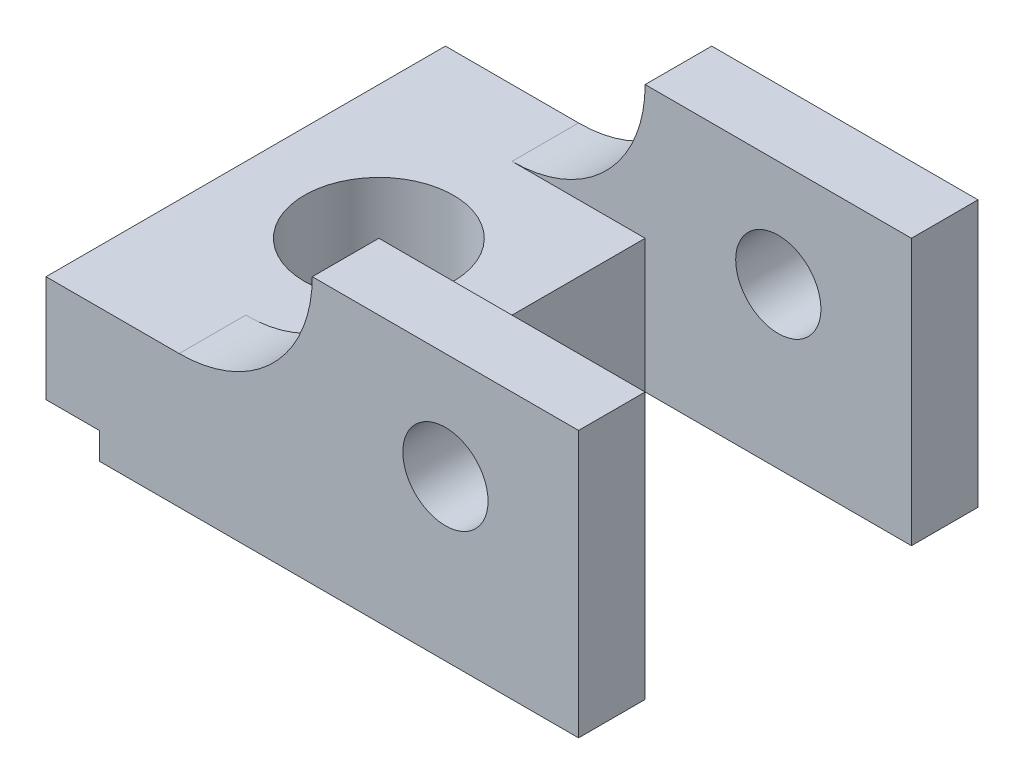
ISO-10303-21;
HEADER;
FILE_DESCRIPTION(('STEP AP214'),'2;1');
FILE_NAME('part.step','',(''),(''),'','','');
FILE_SCHEMA(('AUTOMOTIVE_DESIGN { 1 0 10303 214 1 1 1 1 }'));
ENDSEC;
DATA;
#1=APPLICATION_CONTEXT('core data for automotive mechanical design processes');
#2=APPLICATION_PROTOCOL_DEFINITION('international standard','automotive_design',2000,#1);
#3=PRODUCT_CONTEXT('',#1,'mechanical');
#4=PRODUCT('Part','Part','',(#3));
#5=PRODUCT_RELATED_PRODUCT_CATEGORY('part','',(#4));
#6=PRODUCT_DEFINITION_FORMATION('','',#4);
#7=PRODUCT_DEFINITION_CONTEXT('part definition',#1,'design');
#8=PRODUCT_DEFINITION('design','',#6,#7);
#9=PRODUCT_DEFINITION_SHAPE('','',#8);
#10=(LENGTH_UNIT() NAMED_UNIT(*) SI_UNIT(.MILLI.,.METRE.));
#11=(NAMED_UNIT(*) PLANE_ANGLE_UNIT() SI_UNIT($,.RADIAN.));
#12=(NAMED_UNIT(*) SI_UNIT($,.STERADIAN.) SOLID_ANGLE_UNIT());
#13=UNCERTAINTY_MEASURE_WITH_UNIT(LENGTH_MEASURE(1.E-05),#10,'distance_accuracy_value','');
#14=(GEOMETRIC_REPRESENTATION_CONTEXT(3) GLOBAL_UNCERTAINTY_ASSIGNED_CONTEXT((#13)) GLOBAL_UNIT_ASSIGNED_CONTEXT((#10,
#11,#12)) REPRESENTATION_CONTEXT('',''));
#15=CARTESIAN_POINT('',(0.,0.,0.));
#16=DIRECTION('',(0.,0.,1.));
#17=DIRECTION('',(1.,0.,0.));
#18=AXIS2_PLACEMENT_3D('',#15,#16,#17);
#19=CARTESIAN_POINT('',(0.,0.,15.));
#20=DIRECTION('',(0.,1.,0.));
#21=DIRECTION('',(0.,0.,1.));
#22=AXIS2_PLACEMENT_3D('',#19,#20,#21);
#23=PLANE('',#22);
#24=DIRECTION('',(0.,0.,-1.));
#25=VECTOR('',#24,1.);
#26=CARTESIAN_POINT('',(2.,0.,0.));
#27=LINE('',#26,#25);
#28=CARTESIAN_POINT('',(2.,0.,15.));
#29=VERTEX_POINT('',#28);
#30=CARTESIAN_POINT('',(2.,0.,0.));
#31=VERTEX_POINT('',#30);
#32=EDGE_CURVE('E51',#29,#31,#27,.T.);
#33=ORIENTED_EDGE('',*,*,#32,.F.);
#34=DIRECTION('',(1.,0.,0.));
#35=VECTOR('',#34,1.);
#36=CARTESIAN_POINT('',(0.,0.,15.));
#37=LINE('',#36,#35);
#38=CARTESIAN_POINT('',(0.,0.,15.));
#39=VERTEX_POINT('',#38);
#40=EDGE_CURVE('E149',#39,#29,#37,.T.);
#41=ORIENTED_EDGE('',*,*,#40,.F.);
#42=DIRECTION('',(0.,0.,-1.));
#43=VECTOR('',#42,1.);
#44=CARTESIAN_POINT('',(0.,0.,15.));
#45=LINE('',#44,#43);
#46=CARTESIAN_POINT('',(0.,0.,0.));
#47=VERTEX_POINT('',#46);
#48=EDGE_CURVE('E241',#39,#47,#45,.T.);
#49=ORIENTED_EDGE('',*,*,#48,.T.);
#50=DIRECTION('',(1.,0.,0.));
#51=VECTOR('',#50,1.);
#52=CARTESIAN_POINT('',(0.,0.,0.));
#53=LINE('',#52,#51);
#54=EDGE_CURVE('E56',#47,#31,#53,.T.);
#55=ORIENTED_EDGE('',*,*,#54,.T.);
#56=EDGE_LOOP('',(#33,#41,#49,#55));
#57=FACE_BOUND('',#56,.T.);
#58=ADVANCED_FACE('F35',(#57),#23,.F.);
#59=CARTESIAN_POINT('',(5.,-7.2,7.5));
#60=DIRECTION('',(0.,1.,0.));
#61=DIRECTION('',(0.,0.,1.));
#62=AXIS2_PLACEMENT_3D('',#59,#60,#61);
#63=CYLINDRICAL_SURFACE('',#62,1.97447116828648);
#64=CARTESIAN_POINT('',(5.,1.,7.5));
#65=DIRECTION('',(0.,1.,0.));
#66=DIRECTION('',(0.,0.,1.));
#67=AXIS2_PLACEMENT_3D('',#64,#65,#66);
#68=CIRCLE('',#67,1.97447116828648);
#69=CARTESIAN_POINT('',(5.,1.,9.47447116828648));
#70=VERTEX_POINT('',#69);
#71=EDGE_CURVE('E39',#70,#70,#68,.F.);
#72=ORIENTED_EDGE('',*,*,#71,.F.);
#73=EDGE_LOOP('',(#72));
#74=FACE_BOUND('',#73,.T.);
#75=CARTESIAN_POINT('',(5.,-1.,7.5));
#76=DIRECTION('',(0.,-1.,0.));
#77=DIRECTION('',(0.,0.,-1.));
#78=AXIS2_PLACEMENT_3D('',#75,#76,#77);
#79=CIRCLE('',#78,1.97447116828648);
#80=CARTESIAN_POINT('',(5.,-1.,5.52552883171352));
#81=VERTEX_POINT('',#80);
#82=EDGE_CURVE('E169',#81,#81,#79,.T.);
#83=ORIENTED_EDGE('',*,*,#82,.T.);
#84=EDGE_LOOP('',(#83));
#85=FACE_BOUND('',#84,.T.);
#86=ADVANCED_FACE('F286',(#74,#85),#63,.F.);
#87=CARTESIAN_POINT('',(20.,4.,15.));
#88=DIRECTION('',(-1.,0.,0.));
#89=DIRECTION('',(0.,0.,1.));
#90=AXIS2_PLACEMENT_3D('',#87,#88,#89);
#91=PLANE('',#90);
#92=DIRECTION('',(0.,0.,-1.));
#93=VECTOR('',#92,1.);
#94=CARTESIAN_POINT('',(20.,-1.,15.));
#95=LINE('',#94,#93);
#96=CARTESIAN_POINT('',(20.,-1.,15.));
#97=VERTEX_POINT('',#96);
#98=CARTESIAN_POINT('',(20.,-0.999999999999999,12.5));
#99=VERTEX_POINT('',#98);
#100=EDGE_CURVE('E145',#97,#99,#95,.T.);
#101=ORIENTED_EDGE('',*,*,#100,.T.);
#102=DIRECTION('',(0.,1.,0.));
#103=VECTOR('',#102,1.);
#104=CARTESIAN_POINT('',(20.,-11.,12.5));
#105=LINE('',#104,#103);
#106=CARTESIAN_POINT('',(20.,9.,12.5));
#107=VERTEX_POINT('',#106);
#108=EDGE_CURVE('E181',#99,#107,#105,.T.);
#109=ORIENTED_EDGE('',*,*,#108,.T.);
#110=DIRECTION('',(0.,0.,-1.));
#111=VECTOR('',#110,1.);
#112=CARTESIAN_POINT('',(20.,9.,15.));
#113=LINE('',#112,#111);
#114=CARTESIAN_POINT('',(20.,9.,15.));
#115=VERTEX_POINT('',#114);
#116=EDGE_CURVE('E236',#115,#107,#113,.T.);
#117=ORIENTED_EDGE('',*,*,#116,.F.);
#118=DIRECTION('',(0.,1.,0.));
#119=VECTOR('',#118,1.);
#120=CARTESIAN_POINT('',(20.,0.,15.));
#121=LINE('',#120,#119);
#122=EDGE_CURVE('E148',#97,#115,#121,.T.);
#123=ORIENTED_EDGE('',*,*,#122,.F.);
#124=EDGE_LOOP('',(#101,#109,#117,#123));
#125=FACE_BOUND('',#124,.T.);
#126=ADVANCED_FACE('F293',(#125),#91,.F.);
#127=CARTESIAN_POINT('',(20.,9.,15.));
#128=DIRECTION('',(0.,-1.,0.));
#129=DIRECTION('',(1.,0.,0.));
#130=AXIS2_PLACEMENT_3D('',#127,#128,#129);
#131=PLANE('',#130);
#132=ORIENTED_EDGE('',*,*,#116,.T.);
#133=DIRECTION('',(1.,0.,0.));
#134=VECTOR('',#133,1.);
#135=CARTESIAN_POINT('',(20.,9.,12.5));
#136=LINE('',#135,#134);
#137=CARTESIAN_POINT('',(10.,9.,12.5));
#138=VERTEX_POINT('',#137);
#139=EDGE_CURVE('E178',#138,#107,#136,.T.);
#140=ORIENTED_EDGE('',*,*,#139,.F.);
#141=DIRECTION('',(0.,0.,-1.));
#142=VECTOR('',#141,1.);
#143=CARTESIAN_POINT('',(10.,9.,15.));
#144=LINE('',#143,#142);
#145=CARTESIAN_POINT('',(10.,9.,15.));
#146=VERTEX_POINT('',#145);
#147=EDGE_CURVE('E232',#146,#138,#144,.T.);
#148=ORIENTED_EDGE('',*,*,#147,.F.);
#149=DIRECTION('',(-1.,0.,0.));
#150=VECTOR('',#149,1.);
#151=CARTESIAN_POINT('',(20.,9.,15.));
#152=LINE('',#151,#150);
#153=EDGE_CURVE('E209',#115,#146,#152,.T.);
#154=ORIENTED_EDGE('',*,*,#153,.F.);
#155=EDGE_LOOP('',(#132,#140,#148,#154));
#156=FACE_BOUND('',#155,.T.);
#157=ADVANCED_FACE('F271',(#156),#131,.F.);
#158=CARTESIAN_POINT('',(15.,5.,15.));
#159=DIRECTION('',(0.,0.,-1.));
#160=DIRECTION('',(-1.,0.,0.));
#161=AXIS2_PLACEMENT_3D('',#158,#159,#160);
#162=CYLINDRICAL_SURFACE('',#161,1.6);
#163=CARTESIAN_POINT('',(15.,5.,12.5));
#164=DIRECTION('',(0.,0.,1.));
#165=DIRECTION('',(1.,0.,0.));
#166=AXIS2_PLACEMENT_3D('',#163,#164,#165);
#167=CIRCLE('',#166,1.6);
#168=CARTESIAN_POINT('',(16.6,5.,12.5));
#169=VERTEX_POINT('',#168);
#170=EDGE_CURVE('E194',#169,#169,#167,.T.);
#171=ORIENTED_EDGE('',*,*,#170,.F.);
#172=EDGE_LOOP('',(#171));
#173=FACE_BOUND('',#172,.T.);
#174=CARTESIAN_POINT('',(15.,5.,15.));
#175=DIRECTION('',(0.,0.,1.));
#176=DIRECTION('',(1.,0.,0.));
#177=AXIS2_PLACEMENT_3D('',#174,#175,#176);
#178=CIRCLE('',#177,1.6);
#179=CARTESIAN_POINT('',(16.6,5.,15.));
#180=VERTEX_POINT('',#179);
#181=EDGE_CURVE('E198',#180,#180,#178,.T.);
#182=ORIENTED_EDGE('',*,*,#181,.T.);
#183=EDGE_LOOP('',(#182));
#184=FACE_BOUND('',#183,.T.);
#185=ADVANCED_FACE('F342',(#173,#184),#162,.F.);
#186=CARTESIAN_POINT('',(0.,0.,15.));
#187=DIRECTION('',(0.,0.,-1.));
#188=DIRECTION('',(-1.,0.,0.));
#189=AXIS2_PLACEMENT_3D('',#186,#187,#188);
#190=PLANE('',#189);
#191=DIRECTION('',(0.,1.,0.));
#192=VECTOR('',#191,1.);
#193=CARTESIAN_POINT('',(2.,-1.,15.));
#194=LINE('',#193,#192);
#195=CARTESIAN_POINT('',(2.,-1.,15.));
#196=VERTEX_POINT('',#195);
#197=EDGE_CURVE('E152',#196,#29,#194,.T.);
#198=ORIENTED_EDGE('',*,*,#197,.F.);
#199=DIRECTION('',(1.,0.,0.));
#200=VECTOR('',#199,1.);
#201=CARTESIAN_POINT('',(10.,-1.,15.));
#202=LINE('',#201,#200);
#203=EDGE_CURVE('E134',#196,#97,#202,.T.);
#204=ORIENTED_EDGE('',*,*,#203,.T.);
#205=ORIENTED_EDGE('',*,*,#122,.T.);
#206=ORIENTED_EDGE('',*,*,#153,.T.);
#207=CARTESIAN_POINT('',(5.,9.,15.));
#208=DIRECTION('',(0.,0.,-1.));
#209=DIRECTION('',(-1.,0.,0.));
#210=AXIS2_PLACEMENT_3D('',#207,#208,#209);
#211=CIRCLE('',#210,5.);
#212=CARTESIAN_POINT('',(5.,4.,15.));
#213=VERTEX_POINT('',#212);
#214=EDGE_CURVE('E11',#146,#213,#211,.T.);
#215=ORIENTED_EDGE('',*,*,#214,.T.);
#216=DIRECTION('',(-1.,0.,0.));
#217=VECTOR('',#216,1.);
#218=CARTESIAN_POINT('',(0.,4.,15.));
#219=LINE('',#218,#217);
#220=CARTESIAN_POINT('',(0.,4.,15.));
#221=VERTEX_POINT('',#220);
#222=EDGE_CURVE('E211',#213,#221,#219,.T.);
#223=ORIENTED_EDGE('',*,*,#222,.T.);
#224=DIRECTION('',(0.,-1.,0.));
#225=VECTOR('',#224,1.);
#226=CARTESIAN_POINT('',(0.,0.,15.));
#227=LINE('',#226,#225);
#228=EDGE_CURVE('E204',#221,#39,#227,.T.);
#229=ORIENTED_EDGE('',*,*,#228,.T.);
#230=ORIENTED_EDGE('',*,*,#40,.T.);
#231=EDGE_LOOP('',(#198,#204,#205,#206,#215,#223,#229,#230));
#232=FACE_BOUND('',#231,.T.);
#233=ORIENTED_EDGE('',*,*,#181,.F.);
#234=EDGE_LOOP('',(#233));
#235=FACE_BOUND('',#234,.T.);
#236=ADVANCED_FACE('F153',(#232,#235),#190,.F.);
#237=CARTESIAN_POINT('',(0.,0.,0.));
#238=DIRECTION('',(0.,0.,-1.));
#239=DIRECTION('',(-1.,0.,0.));
#240=AXIS2_PLACEMENT_3D('',#237,#238,#239);
#241=PLANE('',#240);
#242=DIRECTION('',(0.,-1.,0.));
#243=VECTOR('',#242,1.);
#244=CARTESIAN_POINT('',(0.,0.,0.));
#245=LINE('',#244,#243);
#246=CARTESIAN_POINT('',(0.,4.,0.));
#247=VERTEX_POINT('',#246);
#248=EDGE_CURVE('E201',#247,#47,#245,.T.);
#249=ORIENTED_EDGE('',*,*,#248,.F.);
#250=DIRECTION('',(-1.,0.,0.));
#251=VECTOR('',#250,1.);
#252=CARTESIAN_POINT('',(0.,4.,0.));
#253=LINE('',#252,#251);
#254=CARTESIAN_POINT('',(5.,4.,0.));
#255=VERTEX_POINT('',#254);
#256=EDGE_CURVE('E206',#255,#247,#253,.T.);
#257=ORIENTED_EDGE('',*,*,#256,.F.);
#258=CARTESIAN_POINT('',(5.,9.,0.));
#259=DIRECTION('',(0.,0.,-1.));
#260=DIRECTION('',(-1.,0.,0.));
#261=AXIS2_PLACEMENT_3D('',#258,#259,#260);
#262=CIRCLE('',#261,5.);
#263=CARTESIAN_POINT('',(10.,9.,0.));
#264=VERTEX_POINT('',#263);
#265=EDGE_CURVE('E258',#255,#264,#262,.F.);
#266=ORIENTED_EDGE('',*,*,#265,.T.);
#267=DIRECTION('',(-1.,0.,0.));
#268=VECTOR('',#267,1.);
#269=CARTESIAN_POINT('',(20.,9.,0.));
#270=LINE('',#269,#268);
#271=CARTESIAN_POINT('',(20.,9.,0.));
#272=VERTEX_POINT('',#271);
#273=EDGE_CURVE('E222',#272,#264,#270,.T.);
#274=ORIENTED_EDGE('',*,*,#273,.F.);
#275=DIRECTION('',(0.,1.,0.));
#276=VECTOR('',#275,1.);
#277=CARTESIAN_POINT('',(20.,4.,0.));
#278=LINE('',#277,#276);
#279=CARTESIAN_POINT('',(20.,-1.,0.));
#280=VERTEX_POINT('',#279);
#281=EDGE_CURVE('E219',#280,#272,#278,.T.);
#282=ORIENTED_EDGE('',*,*,#281,.F.);
#283=DIRECTION('',(1.,0.,0.));
#284=VECTOR('',#283,1.);
#285=CARTESIAN_POINT('',(10.,-1.,0.));
#286=LINE('',#285,#284);
#287=CARTESIAN_POINT('',(2.,-1.,0.));
#288=VERTEX_POINT('',#287);
#289=EDGE_CURVE('E217',#288,#280,#286,.T.);
#290=ORIENTED_EDGE('',*,*,#289,.F.);
#291=DIRECTION('',(0.,1.,0.));
#292=VECTOR('',#291,1.);
#293=CARTESIAN_POINT('',(2.,-1.,0.));
#294=LINE('',#293,#292);
#295=EDGE_CURVE('E158',#288,#31,#294,.T.);
#296=ORIENTED_EDGE('',*,*,#295,.T.);
#297=ORIENTED_EDGE('',*,*,#54,.F.);
#298=EDGE_LOOP('',(#249,#257,#266,#274,#282,#290,#296,#297));
#299=FACE_BOUND('',#298,.T.);
#300=CARTESIAN_POINT('',(15.,5.,0.));
#301=DIRECTION('',(0.,0.,1.));
#302=DIRECTION('',(1.,0.,0.));
#303=AXIS2_PLACEMENT_3D('',#300,#301,#302);
#304=CIRCLE('',#303,1.6);
#305=CARTESIAN_POINT('',(16.6,5.,0.));
#306=VERTEX_POINT('',#305);
#307=EDGE_CURVE('E197',#306,#306,#304,.T.);
#308=ORIENTED_EDGE('',*,*,#307,.T.);
#309=EDGE_LOOP('',(#308));
#310=FACE_BOUND('',#309,.T.);
#311=ADVANCED_FACE('F300',(#299,#310),#241,.T.);
#312=CARTESIAN_POINT('',(0.,0.,15.));
#313=DIRECTION('',(1.,0.,0.));
#314=DIRECTION('',(0.,0.,-1.));
#315=AXIS2_PLACEMENT_3D('',#312,#313,#314);
#316=PLANE('',#315);
#317=ORIENTED_EDGE('',*,*,#248,.T.);
#318=ORIENTED_EDGE('',*,*,#48,.F.);
#319=ORIENTED_EDGE('',*,*,#228,.F.);
#320=DIRECTION('',(0.,0.,-1.));
#321=VECTOR('',#320,1.);
#322=CARTESIAN_POINT('',(0.,4.,15.));
#323=LINE('',#322,#321);
#324=EDGE_CURVE('E213',#221,#247,#323,.T.);
#325=ORIENTED_EDGE('',*,*,#324,.T.);
#326=EDGE_LOOP('',(#317,#318,#319,#325));
#327=FACE_BOUND('',#326,.T.);
#328=ADVANCED_FACE('F284',(#327),#316,.F.);
#329=CARTESIAN_POINT('',(10.,-1.,15.));
#330=DIRECTION('',(0.,1.,0.));
#331=DIRECTION('',(0.,0.,1.));
#332=AXIS2_PLACEMENT_3D('',#329,#330,#331);
#333=PLANE('',#332);
#334=CARTESIAN_POINT('',(20.,-0.999999999999999,2.5));
#335=VERTEX_POINT('',#334);
#336=EDGE_CURVE('E239',#335,#280,#95,.T.);
#337=ORIENTED_EDGE('',*,*,#336,.F.);
#338=DIRECTION('',(-1.,0.,0.));
#339=VECTOR('',#338,1.);
#340=CARTESIAN_POINT('',(10.,-1.,2.5));
#341=LINE('',#340,#339);
#342=CARTESIAN_POINT('',(10.,-1.,2.5));
#343=VERTEX_POINT('',#342);
#344=EDGE_CURVE('E191',#335,#343,#341,.T.);
#345=ORIENTED_EDGE('',*,*,#344,.T.);
#346=DIRECTION('',(0.,0.,1.));
#347=VECTOR('',#346,1.);
#348=CARTESIAN_POINT('',(10.,-1.,0.));
#349=LINE('',#348,#347);
#350=CARTESIAN_POINT('',(10.,-1.,12.5));
#351=VERTEX_POINT('',#350);
#352=EDGE_CURVE('E162',#343,#351,#349,.T.);
#353=ORIENTED_EDGE('',*,*,#352,.T.);
#354=DIRECTION('',(1.,0.,0.));
#355=VECTOR('',#354,1.);
#356=CARTESIAN_POINT('',(10.,-1.,12.5));
#357=LINE('',#356,#355);
#358=EDGE_CURVE('E195',#351,#99,#357,.T.);
#359=ORIENTED_EDGE('',*,*,#358,.T.);
#360=ORIENTED_EDGE('',*,*,#100,.F.);
#361=ORIENTED_EDGE('',*,*,#203,.F.);
#362=DIRECTION('',(0.,0.,-1.));
#363=VECTOR('',#362,1.);
#364=CARTESIAN_POINT('',(2.,-1.,0.));
#365=LINE('',#364,#363);
#366=EDGE_CURVE('E141',#196,#288,#365,.T.);
#367=ORIENTED_EDGE('',*,*,#366,.T.);
#368=ORIENTED_EDGE('',*,*,#289,.T.);
#369=EDGE_LOOP('',(#337,#345,#353,#359,#360,#361,#367,#368));
#370=FACE_BOUND('',#369,.T.);
#371=ORIENTED_EDGE('',*,*,#82,.F.);
#372=EDGE_LOOP('',(#371));
#373=FACE_BOUND('',#372,.T.);
#374=ADVANCED_FACE('F137',(#370,#373),#333,.F.);
#375=CARTESIAN_POINT('',(20.,9.,2.5));
#376=VERTEX_POINT('',#375);
#377=EDGE_CURVE('E235',#376,#272,#113,.T.);
#378=ORIENTED_EDGE('',*,*,#377,.F.);
#379=DIRECTION('',(0.,1.,0.));
#380=VECTOR('',#379,1.);
#381=CARTESIAN_POINT('',(20.,-11.,2.5));
#382=LINE('',#381,#380);
#383=EDGE_CURVE('E180',#335,#376,#382,.T.);
#384=ORIENTED_EDGE('',*,*,#383,.F.);
#385=ORIENTED_EDGE('',*,*,#336,.T.);
#386=ORIENTED_EDGE('',*,*,#281,.T.);
#387=EDGE_LOOP('',(#378,#384,#385,#386));
#388=FACE_BOUND('',#387,.T.);
#389=ADVANCED_FACE('F327',(#388),#91,.F.);
#390=CARTESIAN_POINT('',(10.,9.,2.5));
#391=VERTEX_POINT('',#390);
#392=EDGE_CURVE('E231',#391,#264,#144,.T.);
#393=ORIENTED_EDGE('',*,*,#392,.F.);
#394=DIRECTION('',(-1.,0.,0.));
#395=VECTOR('',#394,1.);
#396=CARTESIAN_POINT('',(20.,9.,2.5));
#397=LINE('',#396,#395);
#398=EDGE_CURVE('E176',#376,#391,#397,.T.);
#399=ORIENTED_EDGE('',*,*,#398,.F.);
#400=ORIENTED_EDGE('',*,*,#377,.T.);
#401=ORIENTED_EDGE('',*,*,#273,.T.);
#402=EDGE_LOOP('',(#393,#399,#400,#401));
#403=FACE_BOUND('',#402,.T.);
#404=ADVANCED_FACE('F331',(#403),#131,.F.);
#405=CARTESIAN_POINT('',(0.,4.,15.));
#406=DIRECTION('',(0.,-1.,0.));
#407=DIRECTION('',(0.,0.,-1.));
#408=AXIS2_PLACEMENT_3D('',#405,#406,#407);
#409=PLANE('',#408);
#410=CARTESIAN_POINT('',(5.,4.,7.5));
#411=DIRECTION('',(0.,1.,0.));
#412=DIRECTION('',(0.,0.,1.));
#413=AXIS2_PLACEMENT_3D('',#410,#411,#412);
#414=CIRCLE('',#413,2.8);
#415=CARTESIAN_POINT('',(5.,4.,10.3));
#416=VERTEX_POINT('',#415);
#417=EDGE_CURVE('E157',#416,#416,#414,.T.);
#418=ORIENTED_EDGE('',*,*,#417,.F.);
#419=EDGE_LOOP('',(#418));
#420=FACE_BOUND('',#419,.T.);
#421=DIRECTION('',(-1.,0.,0.));
#422=VECTOR('',#421,1.);
#423=CARTESIAN_POINT('',(20.,4.,2.5));
#424=LINE('',#423,#422);
#425=CARTESIAN_POINT('',(10.,4.,2.5));
#426=VERTEX_POINT('',#425);
#427=CARTESIAN_POINT('',(5.,4.,2.5));
#428=VERTEX_POINT('',#427);
#429=EDGE_CURVE('E252',#426,#428,#424,.T.);
#430=ORIENTED_EDGE('',*,*,#429,.T.);
#431=DIRECTION('',(0.,0.,-1.));
#432=VECTOR('',#431,1.);
#433=CARTESIAN_POINT('',(5.,4.,0.));
#434=LINE('',#433,#432);
#435=EDGE_CURVE('E255',#428,#255,#434,.T.);
#436=ORIENTED_EDGE('',*,*,#435,.T.);
#437=ORIENTED_EDGE('',*,*,#256,.T.);
#438=ORIENTED_EDGE('',*,*,#324,.F.);
#439=ORIENTED_EDGE('',*,*,#222,.F.);
#440=DIRECTION('',(0.,0.,-1.));
#441=VECTOR('',#440,1.);
#442=CARTESIAN_POINT('',(5.,4.,12.5));
#443=LINE('',#442,#441);
#444=CARTESIAN_POINT('',(5.,4.,12.5));
#445=VERTEX_POINT('',#444);
#446=EDGE_CURVE('E249',#213,#445,#443,.T.);
#447=ORIENTED_EDGE('',*,*,#446,.T.);
#448=DIRECTION('',(1.,0.,0.));
#449=VECTOR('',#448,1.);
#450=CARTESIAN_POINT('',(20.,4.,12.5));
#451=LINE('',#450,#449);
#452=CARTESIAN_POINT('',(10.,4.,12.5));
#453=VERTEX_POINT('',#452);
#454=EDGE_CURVE('E243',#445,#453,#451,.T.);
#455=ORIENTED_EDGE('',*,*,#454,.T.);
#456=DIRECTION('',(0.,0.,-1.));
#457=VECTOR('',#456,1.);
#458=CARTESIAN_POINT('',(10.,4.,15.));
#459=LINE('',#458,#457);
#460=EDGE_CURVE('E228',#453,#426,#459,.T.);
#461=ORIENTED_EDGE('',*,*,#460,.T.);
#462=EDGE_LOOP('',(#430,#436,#437,#438,#439,#447,#455,#461));
#463=FACE_BOUND('',#462,.T.);
#464=ADVANCED_FACE('F278',(#420,#463),#409,.F.);
#465=CARTESIAN_POINT('',(15.,5.,2.5));
#466=DIRECTION('',(0.,0.,-1.));
#467=DIRECTION('',(-1.,0.,0.));
#468=AXIS2_PLACEMENT_3D('',#465,#466,#467);
#469=CIRCLE('',#468,1.6);
#470=CARTESIAN_POINT('',(13.4,5.,2.5));
#471=VERTEX_POINT('',#470);
#472=EDGE_CURVE('E184',#471,#471,#469,.T.);
#473=ORIENTED_EDGE('',*,*,#472,.F.);
#474=EDGE_LOOP('',(#473));
#475=FACE_BOUND('',#474,.T.);
#476=ORIENTED_EDGE('',*,*,#307,.F.);
#477=EDGE_LOOP('',(#476));
#478=FACE_BOUND('',#477,.T.);
#479=ADVANCED_FACE('F338',(#475,#478),#162,.F.);
#480=CARTESIAN_POINT('',(10.,-11.,12.5));
#481=DIRECTION('',(-1.,0.,0.));
#482=DIRECTION('',(0.,-1.,0.));
#483=AXIS2_PLACEMENT_3D('',#480,#481,#482);
#484=PLANE('',#483);
#485=DIRECTION('',(0.,1.,0.));
#486=VECTOR('',#485,1.);
#487=CARTESIAN_POINT('',(10.,-11.,2.5));
#488=LINE('',#487,#486);
#489=EDGE_CURVE('E188',#343,#426,#488,.T.);
#490=ORIENTED_EDGE('',*,*,#489,.T.);
#491=ORIENTED_EDGE('',*,*,#460,.F.);
#492=DIRECTION('',(0.,1.,0.));
#493=VECTOR('',#492,1.);
#494=CARTESIAN_POINT('',(10.,-11.,12.5));
#495=LINE('',#494,#493);
#496=EDGE_CURVE('E185',#351,#453,#495,.T.);
#497=ORIENTED_EDGE('',*,*,#496,.F.);
#498=ORIENTED_EDGE('',*,*,#352,.F.);
#499=EDGE_LOOP('',(#490,#491,#497,#498));
#500=FACE_BOUND('',#499,.T.);
#501=ADVANCED_FACE('F322',(#500),#484,.F.);
#502=CARTESIAN_POINT('',(20.,-11.,12.5));
#503=DIRECTION('',(0.,0.,1.));
#504=DIRECTION('',(1.,0.,0.));
#505=AXIS2_PLACEMENT_3D('',#502,#503,#504);
#506=PLANE('',#505);
#507=ORIENTED_EDGE('',*,*,#170,.T.);
#508=EDGE_LOOP('',(#507));
#509=FACE_BOUND('',#508,.T.);
#510=ORIENTED_EDGE('',*,*,#358,.F.);
#511=ORIENTED_EDGE('',*,*,#496,.T.);
#512=ORIENTED_EDGE('',*,*,#454,.F.);
#513=CARTESIAN_POINT('',(5.,9.,12.5));
#514=DIRECTION('',(0.,0.,1.));
#515=DIRECTION('',(1.,0.,0.));
#516=AXIS2_PLACEMENT_3D('',#513,#514,#515);
#517=CIRCLE('',#516,5.);
#518=EDGE_CURVE('E44',#445,#138,#517,.T.);
#519=ORIENTED_EDGE('',*,*,#518,.T.);
#520=ORIENTED_EDGE('',*,*,#139,.T.);
#521=ORIENTED_EDGE('',*,*,#108,.F.);
#522=EDGE_LOOP('',(#510,#511,#512,#519,#520,#521));
#523=FACE_BOUND('',#522,.T.);
#524=ADVANCED_FACE('F266',(#509,#523),#506,.F.);
#525=CARTESIAN_POINT('',(20.,-11.,2.5));
#526=DIRECTION('',(0.,0.,-1.));
#527=DIRECTION('',(-1.,0.,0.));
#528=AXIS2_PLACEMENT_3D('',#525,#526,#527);
#529=PLANE('',#528);
#530=ORIENTED_EDGE('',*,*,#472,.T.);
#531=EDGE_LOOP('',(#530));
#532=FACE_BOUND('',#531,.T.);
#533=ORIENTED_EDGE('',*,*,#383,.T.);
#534=ORIENTED_EDGE('',*,*,#398,.T.);
#535=CARTESIAN_POINT('',(5.,9.,2.5));
#536=DIRECTION('',(0.,0.,-1.));
#537=DIRECTION('',(-1.,0.,0.));
#538=AXIS2_PLACEMENT_3D('',#535,#536,#537);
#539=CIRCLE('',#538,5.);
#540=EDGE_CURVE('E260',#391,#428,#539,.T.);
#541=ORIENTED_EDGE('',*,*,#540,.T.);
#542=ORIENTED_EDGE('',*,*,#429,.F.);
#543=ORIENTED_EDGE('',*,*,#489,.F.);
#544=ORIENTED_EDGE('',*,*,#344,.F.);
#545=EDGE_LOOP('',(#533,#534,#541,#542,#543,#544));
#546=FACE_BOUND('',#545,.T.);
#547=ADVANCED_FACE('F303',(#532,#546),#529,.F.);
#548=CARTESIAN_POINT('',(5.,9.,15.));
#549=DIRECTION('',(0.,0.,1.));
#550=DIRECTION('',(1.,0.,0.));
#551=AXIS2_PLACEMENT_3D('',#548,#549,#550);
#552=CYLINDRICAL_SURFACE('',#551,5.);
#553=ORIENTED_EDGE('',*,*,#540,.F.);
#554=ORIENTED_EDGE('',*,*,#392,.T.);
#555=ORIENTED_EDGE('',*,*,#265,.F.);
#556=ORIENTED_EDGE('',*,*,#435,.F.);
#557=EDGE_LOOP('',(#553,#554,#555,#556));
#558=FACE_BOUND('',#557,.T.);
#559=ADVANCED_FACE('F301',(#558),#552,.F.);
#560=CARTESIAN_POINT('',(5.,9.,15.));
#561=DIRECTION('',(0.,0.,1.));
#562=DIRECTION('',(1.,0.,0.));
#563=AXIS2_PLACEMENT_3D('',#560,#561,#562);
#564=CYLINDRICAL_SURFACE('',#563,5.);
#565=ORIENTED_EDGE('',*,*,#214,.F.);
#566=ORIENTED_EDGE('',*,*,#147,.T.);
#567=ORIENTED_EDGE('',*,*,#518,.F.);
#568=ORIENTED_EDGE('',*,*,#446,.F.);
#569=EDGE_LOOP('',(#565,#566,#567,#568));
#570=FACE_BOUND('',#569,.T.);
#571=ADVANCED_FACE('F37',(#570),#564,.F.);
#572=CARTESIAN_POINT('',(5.,1.,7.5));
#573=DIRECTION('',(0.,1.,0.));
#574=DIRECTION('',(0.,0.,1.));
#575=AXIS2_PLACEMENT_3D('',#572,#573,#574);
#576=PLANE('',#575);
#577=CARTESIAN_POINT('',(5.,1.,7.5));
#578=DIRECTION('',(0.,1.,0.));
#579=DIRECTION('',(0.,0.,1.));
#580=AXIS2_PLACEMENT_3D('',#577,#578,#579);
#581=CIRCLE('',#580,2.8);
#582=CARTESIAN_POINT('',(5.,1.,10.3));
#583=VERTEX_POINT('',#582);
#584=EDGE_CURVE('E171',#583,#583,#581,.T.);
#585=ORIENTED_EDGE('',*,*,#584,.T.);
#586=EDGE_LOOP('',(#585));
#587=FACE_BOUND('',#586,.T.);
#588=ORIENTED_EDGE('',*,*,#71,.T.);
#589=EDGE_LOOP('',(#588));
#590=FACE_BOUND('',#589,.T.);
#591=ADVANCED_FACE('F309',(#587,#590),#576,.T.);
#592=CARTESIAN_POINT('',(5.,1.,7.5));
#593=DIRECTION('',(0.,1.,0.));
#594=DIRECTION('',(0.,0.,1.));
#595=AXIS2_PLACEMENT_3D('',#592,#593,#594);
#596=CYLINDRICAL_SURFACE('',#595,2.8);
#597=ORIENTED_EDGE('',*,*,#584,.F.);
#598=EDGE_LOOP('',(#597));
#599=FACE_BOUND('',#598,.T.);
#600=ORIENTED_EDGE('',*,*,#417,.T.);
#601=EDGE_LOOP('',(#600));
#602=FACE_BOUND('',#601,.T.);
#603=ADVANCED_FACE('F370',(#599,#602),#596,.F.);
#604=CARTESIAN_POINT('',(2.,-1.,0.));
#605=DIRECTION('',(1.,0.,0.));
#606=DIRECTION('',(0.,0.,-1.));
#607=AXIS2_PLACEMENT_3D('',#604,#605,#606);
#608=PLANE('',#607);
#609=ORIENTED_EDGE('',*,*,#32,.T.);
#610=ORIENTED_EDGE('',*,*,#295,.F.);
#611=ORIENTED_EDGE('',*,*,#366,.F.);
#612=ORIENTED_EDGE('',*,*,#197,.T.);
#613=EDGE_LOOP('',(#609,#610,#611,#612));
#614=FACE_BOUND('',#613,.T.);
#615=ADVANCED_FACE('F160',(#614),#608,.F.);
#616=CLOSED_SHELL('',(#58,#86,#126,#157,#185,#236,#311,#328,#374,#389,#404,#464,#479,#501,#524,
#547,#559,#571,#591,#603,#615));
#617=MANIFOLD_SOLID_BREP('B2',#616);
#618=ADVANCED_BREP_SHAPE_REPRESENTATION('',(#18,#617),#14);
#619=SHAPE_DEFINITION_REPRESENTATION(#9,#618);
ENDSEC;
END-ISO-10303-21;
